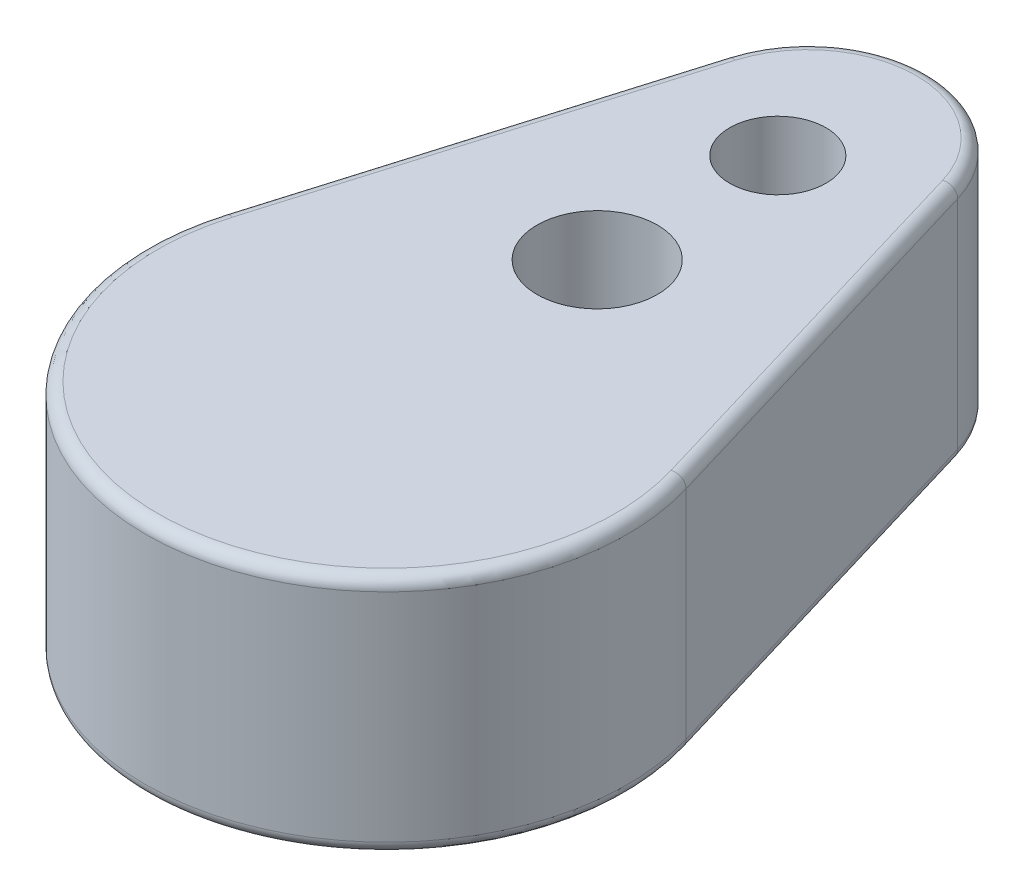
ISO-10303-21;
HEADER;
FILE_DESCRIPTION(('STEP AP214'),'2;1');
FILE_NAME('part.step','',(''),(''),'','','');
FILE_SCHEMA(('AUTOMOTIVE_DESIGN { 1 0 10303 214 1 1 1 1 }'));
ENDSEC;
DATA;
#1=APPLICATION_CONTEXT('core data for automotive mechanical design processes');
#2=APPLICATION_PROTOCOL_DEFINITION('international standard','automotive_design',2000,#1);
#3=PRODUCT_CONTEXT('',#1,'mechanical');
#4=PRODUCT('Part','Part','',(#3));
#5=PRODUCT_RELATED_PRODUCT_CATEGORY('part','',(#4));
#6=PRODUCT_DEFINITION_FORMATION('','',#4);
#7=PRODUCT_DEFINITION_CONTEXT('part definition',#1,'design');
#8=PRODUCT_DEFINITION('design','',#6,#7);
#9=PRODUCT_DEFINITION_SHAPE('','',#8);
#10=(LENGTH_UNIT() NAMED_UNIT(*) SI_UNIT(.MILLI.,.METRE.));
#11=(NAMED_UNIT(*) PLANE_ANGLE_UNIT() SI_UNIT($,.RADIAN.));
#12=(NAMED_UNIT(*) SI_UNIT($,.STERADIAN.) SOLID_ANGLE_UNIT());
#13=UNCERTAINTY_MEASURE_WITH_UNIT(LENGTH_MEASURE(1.E-05),#10,'distance_accuracy_value','');
#14=(GEOMETRIC_REPRESENTATION_CONTEXT(3) GLOBAL_UNCERTAINTY_ASSIGNED_CONTEXT((#13)) GLOBAL_UNIT_ASSIGNED_CONTEXT((#10,
#11,#12)) REPRESENTATION_CONTEXT('',''));
#15=CARTESIAN_POINT('',(0.,0.,0.));
#16=DIRECTION('',(0.,0.,1.));
#17=DIRECTION('',(1.,0.,0.));
#18=AXIS2_PLACEMENT_3D('',#15,#16,#17);
#19=CARTESIAN_POINT('',(0.,20.,17.5));
#20=DIRECTION('',(0.,-1.,0.));
#21=DIRECTION('',(0.,0.,-1.));
#22=AXIS2_PLACEMENT_3D('',#19,#20,#21);
#23=CYLINDRICAL_SURFACE('',#22,20.);
#24=DIRECTION('',(0.,-1.,0.));
#25=VECTOR('',#24,1.);
#26=CARTESIAN_POINT('',(-19.1662969499982,20.,11.7857142857143));
#27=LINE('',#26,#25);
#28=CARTESIAN_POINT('',(-19.1662969499982,19.,11.7857142857143));
#29=VERTEX_POINT('',#28);
#30=CARTESIAN_POINT('',(-19.1662969499982,1.,11.7857142857143));
#31=VERTEX_POINT('',#30);
#32=EDGE_CURVE('E111',#29,#31,#27,.T.);
#33=ORIENTED_EDGE('',*,*,#32,.T.);
#34=CARTESIAN_POINT('',(0.,1.,17.5));
#35=DIRECTION('',(0.,1.,0.));
#36=DIRECTION('',(0.,0.,1.));
#37=AXIS2_PLACEMENT_3D('',#34,#35,#36);
#38=CIRCLE('',#37,20.);
#39=CARTESIAN_POINT('',(19.1662969499982,1.,11.7857142857143));
#40=VERTEX_POINT('',#39);
#41=EDGE_CURVE('E220',#31,#40,#38,.T.);
#42=ORIENTED_EDGE('',*,*,#41,.T.);
#43=DIRECTION('',(0.,-1.,0.));
#44=VECTOR('',#43,1.);
#45=CARTESIAN_POINT('',(19.1662969499982,20.,11.7857142857143));
#46=LINE('',#45,#44);
#47=CARTESIAN_POINT('',(19.1662969499982,19.,11.7857142857143));
#48=VERTEX_POINT('',#47);
#49=EDGE_CURVE('E140',#48,#40,#46,.T.);
#50=ORIENTED_EDGE('',*,*,#49,.F.);
#51=CARTESIAN_POINT('',(0.,19.,17.5));
#52=DIRECTION('',(0.,1.,0.));
#53=DIRECTION('',(0.,0.,1.));
#54=AXIS2_PLACEMENT_3D('',#51,#52,#53);
#55=CIRCLE('',#54,20.);
#56=EDGE_CURVE('E217',#48,#29,#55,.F.);
#57=ORIENTED_EDGE('',*,*,#56,.T.);
#58=EDGE_LOOP('',(#33,#42,#50,#57));
#59=FACE_BOUND('',#58,.T.);
#60=ADVANCED_FACE('F39',(#59),#23,.T.);
#61=CARTESIAN_POINT('',(9.58314847499909,20.,-20.3571428571429));
#62=DIRECTION('',(-0.95831484749991,0.,0.285714285714286));
#63=DIRECTION('',(0.285714285714286,0.,0.95831484749991));
#64=AXIS2_PLACEMENT_3D('',#61,#62,#63);
#65=PLANE('',#64);
#66=ORIENTED_EDGE('',*,*,#49,.T.);
#67=DIRECTION('',(-0.285714285714286,0.,-0.95831484749991));
#68=VECTOR('',#67,1.);
#69=CARTESIAN_POINT('',(9.58314847499909,1.,-20.3571428571429));
#70=LINE('',#69,#68);
#71=CARTESIAN_POINT('',(9.5831484749991,1.,-20.3571428571429));
#72=VERTEX_POINT('',#71);
#73=EDGE_CURVE('E214',#40,#72,#70,.T.);
#74=ORIENTED_EDGE('',*,*,#73,.T.);
#75=DIRECTION('',(0.,-1.,0.));
#76=VECTOR('',#75,1.);
#77=CARTESIAN_POINT('',(9.5831484749991,20.,-20.3571428571429));
#78=LINE('',#77,#76);
#79=CARTESIAN_POINT('',(9.5831484749991,19.,-20.3571428571429));
#80=VERTEX_POINT('',#79);
#81=EDGE_CURVE('E130',#80,#72,#78,.T.);
#82=ORIENTED_EDGE('',*,*,#81,.F.);
#83=DIRECTION('',(-0.285714285714286,0.,-0.95831484749991));
#84=VECTOR('',#83,1.);
#85=CARTESIAN_POINT('',(19.1662969499982,19.,11.7857142857143));
#86=LINE('',#85,#84);
#87=EDGE_CURVE('E211',#80,#48,#86,.F.);
#88=ORIENTED_EDGE('',*,*,#87,.T.);
#89=EDGE_LOOP('',(#66,#74,#82,#88));
#90=FACE_BOUND('',#89,.T.);
#91=ADVANCED_FACE('F236',(#90),#65,.F.);
#92=CARTESIAN_POINT('',(0.,20.,-17.5));
#93=DIRECTION('',(0.,-1.,0.));
#94=DIRECTION('',(0.,0.,-1.));
#95=AXIS2_PLACEMENT_3D('',#92,#93,#94);
#96=CYLINDRICAL_SURFACE('',#95,10.);
#97=ORIENTED_EDGE('',*,*,#81,.T.);
#98=CARTESIAN_POINT('',(0.,1.,-17.5));
#99=DIRECTION('',(0.,1.,0.));
#100=DIRECTION('',(0.,0.,1.));
#101=AXIS2_PLACEMENT_3D('',#98,#99,#100);
#102=CIRCLE('',#101,10.);
#103=CARTESIAN_POINT('',(-9.5831484749991,1.,-20.3571428571429));
#104=VERTEX_POINT('',#103);
#105=EDGE_CURVE('E128',#72,#104,#102,.T.);
#106=ORIENTED_EDGE('',*,*,#105,.T.);
#107=DIRECTION('',(0.,-1.,0.));
#108=VECTOR('',#107,1.);
#109=CARTESIAN_POINT('',(-9.5831484749991,20.,-20.3571428571429));
#110=LINE('',#109,#108);
#111=CARTESIAN_POINT('',(-9.5831484749991,19.,-20.3571428571429));
#112=VERTEX_POINT('',#111);
#113=EDGE_CURVE('E109',#112,#104,#110,.T.);
#114=ORIENTED_EDGE('',*,*,#113,.F.);
#115=CARTESIAN_POINT('',(0.,19.,-17.5));
#116=DIRECTION('',(0.,1.,0.));
#117=DIRECTION('',(0.,0.,1.));
#118=AXIS2_PLACEMENT_3D('',#115,#116,#117);
#119=CIRCLE('',#118,10.);
#120=EDGE_CURVE('E125',#112,#80,#119,.F.);
#121=ORIENTED_EDGE('',*,*,#120,.T.);
#122=EDGE_LOOP('',(#97,#106,#114,#121));
#123=FACE_BOUND('',#122,.T.);
#124=ADVANCED_FACE('F124',(#123),#96,.T.);
#125=CARTESIAN_POINT('',(-9.5831484749991,20.,-20.3571428571429));
#126=DIRECTION('',(0.95831484749991,0.,0.285714285714286));
#127=DIRECTION('',(0.285714285714286,0.,-0.95831484749991));
#128=AXIS2_PLACEMENT_3D('',#125,#126,#127);
#129=PLANE('',#128);
#130=ORIENTED_EDGE('',*,*,#113,.T.);
#131=DIRECTION('',(-0.285714285714286,0.,0.95831484749991));
#132=VECTOR('',#131,1.);
#133=CARTESIAN_POINT('',(-9.5831484749991,1.,-20.3571428571429));
#134=LINE('',#133,#132);
#135=EDGE_CURVE('E11',#104,#31,#134,.T.);
#136=ORIENTED_EDGE('',*,*,#135,.T.);
#137=ORIENTED_EDGE('',*,*,#32,.F.);
#138=DIRECTION('',(-0.285714285714286,0.,0.95831484749991));
#139=VECTOR('',#138,1.);
#140=CARTESIAN_POINT('',(-9.5831484749991,19.,-20.3571428571429));
#141=LINE('',#140,#139);
#142=EDGE_CURVE('E49',#29,#112,#141,.F.);
#143=ORIENTED_EDGE('',*,*,#142,.T.);
#144=EDGE_LOOP('',(#130,#136,#137,#143));
#145=FACE_BOUND('',#144,.T.);
#146=ADVANCED_FACE('F108',(#145),#129,.F.);
#147=CARTESIAN_POINT('',(0.,20.,17.5));
#148=DIRECTION('',(0.,1.,0.));
#149=DIRECTION('',(0.,0.,1.));
#150=AXIS2_PLACEMENT_3D('',#147,#148,#149);
#151=PLANE('',#150);
#152=CARTESIAN_POINT('',(0.,20.,-15.));
#153=DIRECTION('',(0.,1.,0.));
#154=DIRECTION('',(0.,0.,1.));
#155=AXIS2_PLACEMENT_3D('',#152,#153,#154);
#156=CIRCLE('',#155,4.);
#157=CARTESIAN_POINT('',(0.,20.,-11.));
#158=VERTEX_POINT('',#157);
#159=EDGE_CURVE('E297',#158,#158,#156,.T.);
#160=ORIENTED_EDGE('',*,*,#159,.F.);
#161=EDGE_LOOP('',(#160));
#162=FACE_BOUND('',#161,.T.);
#163=CARTESIAN_POINT('',(0.,20.,0.));
#164=DIRECTION('',(0.,-1.,0.));
#165=DIRECTION('',(0.,0.,-1.));
#166=AXIS2_PLACEMENT_3D('',#163,#164,#165);
#167=CIRCLE('',#166,5.);
#168=CARTESIAN_POINT('',(0.,20.,-5.));
#169=VERTEX_POINT('',#168);
#170=EDGE_CURVE('E293',#169,#169,#167,.T.);
#171=ORIENTED_EDGE('',*,*,#170,.T.);
#172=EDGE_LOOP('',(#171));
#173=FACE_BOUND('',#172,.T.);
#174=DIRECTION('',(-0.285714285714286,0.,-0.95831484749991));
#175=VECTOR('',#174,1.);
#176=CARTESIAN_POINT('',(8.62483362749918,20.,-20.0714285714286));
#177=LINE('',#176,#175);
#178=CARTESIAN_POINT('',(18.2079821024983,20.,12.0714285714286));
#179=VERTEX_POINT('',#178);
#180=CARTESIAN_POINT('',(8.62483362749918,20.,-20.0714285714286));
#181=VERTEX_POINT('',#180);
#182=EDGE_CURVE('E57',#179,#181,#177,.T.);
#183=ORIENTED_EDGE('',*,*,#182,.T.);
#184=CARTESIAN_POINT('',(0.,20.,-17.5));
#185=DIRECTION('',(0.,1.,0.));
#186=DIRECTION('',(0.,0.,1.));
#187=AXIS2_PLACEMENT_3D('',#184,#185,#186);
#188=CIRCLE('',#187,9.);
#189=CARTESIAN_POINT('',(-8.62483362749919,20.,-20.0714285714286));
#190=VERTEX_POINT('',#189);
#191=EDGE_CURVE('E117',#181,#190,#188,.T.);
#192=ORIENTED_EDGE('',*,*,#191,.T.);
#193=DIRECTION('',(-0.285714285714286,0.,0.95831484749991));
#194=VECTOR('',#193,1.);
#195=CARTESIAN_POINT('',(-18.2079821024983,20.,12.0714285714286));
#196=LINE('',#195,#194);
#197=CARTESIAN_POINT('',(-18.2079821024983,20.,12.0714285714286));
#198=VERTEX_POINT('',#197);
#199=EDGE_CURVE('E143',#190,#198,#196,.T.);
#200=ORIENTED_EDGE('',*,*,#199,.T.);
#201=CARTESIAN_POINT('',(0.,20.,17.5));
#202=DIRECTION('',(0.,1.,0.));
#203=DIRECTION('',(0.,0.,1.));
#204=AXIS2_PLACEMENT_3D('',#201,#202,#203);
#205=CIRCLE('',#204,19.);
#206=EDGE_CURVE('E62',#198,#179,#205,.T.);
#207=ORIENTED_EDGE('',*,*,#206,.T.);
#208=EDGE_LOOP('',(#183,#192,#200,#207));
#209=FACE_BOUND('',#208,.T.);
#210=ADVANCED_FACE('F230',(#162,#173,#209),#151,.T.);
#211=CARTESIAN_POINT('',(0.,0.,17.5));
#212=DIRECTION('',(0.,1.,0.));
#213=DIRECTION('',(0.,0.,1.));
#214=AXIS2_PLACEMENT_3D('',#211,#212,#213);
#215=PLANE('',#214);
#216=CARTESIAN_POINT('',(0.,0.,0.));
#217=DIRECTION('',(0.,1.,0.));
#218=DIRECTION('',(0.,0.,1.));
#219=AXIS2_PLACEMENT_3D('',#216,#217,#218);
#220=CIRCLE('',#219,4.1);
#221=CARTESIAN_POINT('',(0.,0.,4.1));
#222=VERTEX_POINT('',#221);
#223=EDGE_CURVE('E289',#222,#222,#220,.T.);
#224=ORIENTED_EDGE('',*,*,#223,.T.);
#225=EDGE_LOOP('',(#224));
#226=FACE_BOUND('',#225,.T.);
#227=CARTESIAN_POINT('',(0.,0.,-15.));
#228=DIRECTION('',(0.,1.,0.));
#229=DIRECTION('',(0.,0.,1.));
#230=AXIS2_PLACEMENT_3D('',#227,#228,#229);
#231=CIRCLE('',#230,4.);
#232=CARTESIAN_POINT('',(0.,0.,-11.));
#233=VERTEX_POINT('',#232);
#234=EDGE_CURVE('E145',#233,#233,#231,.T.);
#235=ORIENTED_EDGE('',*,*,#234,.T.);
#236=EDGE_LOOP('',(#235));
#237=FACE_BOUND('',#236,.T.);
#238=DIRECTION('',(-0.285714285714286,0.,0.95831484749991));
#239=VECTOR('',#238,1.);
#240=CARTESIAN_POINT('',(-18.2079821024983,0.,12.0714285714286));
#241=LINE('',#240,#239);
#242=CARTESIAN_POINT('',(-18.2079821024983,0.,12.0714285714286));
#243=VERTEX_POINT('',#242);
#244=CARTESIAN_POINT('',(-8.62483362749919,0.,-20.0714285714286));
#245=VERTEX_POINT('',#244);
#246=EDGE_CURVE('E198',#243,#245,#241,.F.);
#247=ORIENTED_EDGE('',*,*,#246,.T.);
#248=CARTESIAN_POINT('',(0.,0.,-17.5));
#249=DIRECTION('',(0.,1.,0.));
#250=DIRECTION('',(0.,0.,1.));
#251=AXIS2_PLACEMENT_3D('',#248,#249,#250);
#252=CIRCLE('',#251,9.);
#253=CARTESIAN_POINT('',(8.62483362749918,0.,-20.0714285714286));
#254=VERTEX_POINT('',#253);
#255=EDGE_CURVE('E207',#245,#254,#252,.F.);
#256=ORIENTED_EDGE('',*,*,#255,.T.);
#257=DIRECTION('',(-0.285714285714286,0.,-0.95831484749991));
#258=VECTOR('',#257,1.);
#259=CARTESIAN_POINT('',(18.2079821024983,0.,12.0714285714286));
#260=LINE('',#259,#258);
#261=CARTESIAN_POINT('',(18.2079821024983,0.,12.0714285714286));
#262=VERTEX_POINT('',#261);
#263=EDGE_CURVE('E204',#254,#262,#260,.F.);
#264=ORIENTED_EDGE('',*,*,#263,.T.);
#265=CARTESIAN_POINT('',(0.,0.,17.5));
#266=DIRECTION('',(0.,1.,0.));
#267=DIRECTION('',(0.,0.,1.));
#268=AXIS2_PLACEMENT_3D('',#265,#266,#267);
#269=CIRCLE('',#268,19.);
#270=EDGE_CURVE('E201',#262,#243,#269,.F.);
#271=ORIENTED_EDGE('',*,*,#270,.T.);
#272=EDGE_LOOP('',(#247,#256,#264,#271));
#273=FACE_BOUND('',#272,.T.);
#274=ADVANCED_FACE('F262',(#226,#237,#273),#215,.F.);
#275=CARTESIAN_POINT('',(0.,1.,17.5));
#276=DIRECTION('',(0.,1.,0.));
#277=DIRECTION('',(0.,0.,1.));
#278=AXIS2_PLACEMENT_3D('',#275,#276,#277);
#279=TOROIDAL_SURFACE('',#278,19.,1.);
#280=CARTESIAN_POINT('',(-18.2079821024983,1.,12.0714285714286));
#281=DIRECTION('',(0.285714285714285,0.,-0.95831484749991));
#282=DIRECTION('',(-0.95831484749991,0.,-0.285714285714285));
#283=AXIS2_PLACEMENT_3D('',#280,#281,#282);
#284=CIRCLE('',#283,1.);
#285=EDGE_CURVE('E172',#243,#31,#284,.T.);
#286=ORIENTED_EDGE('',*,*,#285,.F.);
#287=ORIENTED_EDGE('',*,*,#270,.F.);
#288=CARTESIAN_POINT('',(18.2079821024983,1.,12.0714285714286));
#289=DIRECTION('',(-0.285714285714285,0.,-0.95831484749991));
#290=DIRECTION('',(-0.95831484749991,0.,0.285714285714285));
#291=AXIS2_PLACEMENT_3D('',#288,#289,#290);
#292=CIRCLE('',#291,1.);
#293=EDGE_CURVE('E155',#40,#262,#292,.T.);
#294=ORIENTED_EDGE('',*,*,#293,.F.);
#295=ORIENTED_EDGE('',*,*,#41,.F.);
#296=EDGE_LOOP('',(#286,#287,#294,#295));
#297=FACE_BOUND('',#296,.T.);
#298=ADVANCED_FACE('F238',(#297),#279,.T.);
#299=CARTESIAN_POINT('',(8.62483362749918,1.,-20.0714285714286));
#300=DIRECTION('',(-0.285714285714286,0.,-0.95831484749991));
#301=DIRECTION('',(-0.95831484749991,0.,0.285714285714286));
#302=AXIS2_PLACEMENT_3D('',#299,#300,#301);
#303=CYLINDRICAL_SURFACE('',#302,1.);
#304=ORIENTED_EDGE('',*,*,#293,.T.);
#305=ORIENTED_EDGE('',*,*,#263,.F.);
#306=CARTESIAN_POINT('',(8.62483362749918,1.,-20.0714285714286));
#307=DIRECTION('',(-0.285714285714285,0.,-0.95831484749991));
#308=DIRECTION('',(-0.95831484749991,0.,0.285714285714285));
#309=AXIS2_PLACEMENT_3D('',#306,#307,#308);
#310=CIRCLE('',#309,1.);
#311=EDGE_CURVE('E165',#72,#254,#310,.T.);
#312=ORIENTED_EDGE('',*,*,#311,.F.);
#313=ORIENTED_EDGE('',*,*,#73,.F.);
#314=EDGE_LOOP('',(#304,#305,#312,#313));
#315=FACE_BOUND('',#314,.T.);
#316=ADVANCED_FACE('F241',(#315),#303,.T.);
#317=CARTESIAN_POINT('',(-8.62483362749919,1.,-20.0714285714286));
#318=DIRECTION('',(-0.285714285714286,0.,0.95831484749991));
#319=DIRECTION('',(0.95831484749991,0.,0.285714285714286));
#320=AXIS2_PLACEMENT_3D('',#317,#318,#319);
#321=CYLINDRICAL_SURFACE('',#320,1.);
#322=ORIENTED_EDGE('',*,*,#285,.T.);
#323=ORIENTED_EDGE('',*,*,#135,.F.);
#324=CARTESIAN_POINT('',(-8.62483362749919,1.,-20.0714285714286));
#325=DIRECTION('',(0.285714285714285,0.,-0.95831484749991));
#326=DIRECTION('',(-0.95831484749991,0.,-0.285714285714285));
#327=AXIS2_PLACEMENT_3D('',#324,#325,#326);
#328=CIRCLE('',#327,1.);
#329=EDGE_CURVE('E162',#245,#104,#328,.T.);
#330=ORIENTED_EDGE('',*,*,#329,.F.);
#331=ORIENTED_EDGE('',*,*,#246,.F.);
#332=EDGE_LOOP('',(#322,#323,#330,#331));
#333=FACE_BOUND('',#332,.T.);
#334=ADVANCED_FACE('F244',(#333),#321,.T.);
#335=CARTESIAN_POINT('',(0.,1.,-17.5));
#336=DIRECTION('',(0.,1.,0.));
#337=DIRECTION('',(0.,0.,1.));
#338=AXIS2_PLACEMENT_3D('',#335,#336,#337);
#339=TOROIDAL_SURFACE('',#338,9.,1.);
#340=ORIENTED_EDGE('',*,*,#311,.T.);
#341=ORIENTED_EDGE('',*,*,#255,.F.);
#342=ORIENTED_EDGE('',*,*,#329,.T.);
#343=ORIENTED_EDGE('',*,*,#105,.F.);
#344=EDGE_LOOP('',(#340,#341,#342,#343));
#345=FACE_BOUND('',#344,.T.);
#346=ADVANCED_FACE('F242',(#345),#339,.T.);
#347=CARTESIAN_POINT('',(0.,19.,17.5));
#348=DIRECTION('',(0.,1.,0.));
#349=DIRECTION('',(0.,0.,1.));
#350=AXIS2_PLACEMENT_3D('',#347,#348,#349);
#351=TOROIDAL_SURFACE('',#350,19.,1.);
#352=CARTESIAN_POINT('',(-18.2079821024983,19.,12.0714285714286));
#353=DIRECTION('',(0.285714285714285,0.,-0.95831484749991));
#354=DIRECTION('',(-0.95831484749991,0.,-0.285714285714285));
#355=AXIS2_PLACEMENT_3D('',#352,#353,#354);
#356=CIRCLE('',#355,1.);
#357=EDGE_CURVE('E149',#29,#198,#356,.T.);
#358=ORIENTED_EDGE('',*,*,#357,.F.);
#359=ORIENTED_EDGE('',*,*,#56,.F.);
#360=CARTESIAN_POINT('',(18.2079821024983,19.,12.0714285714286));
#361=DIRECTION('',(-0.285714285714287,0.,-0.95831484749991));
#362=DIRECTION('',(-0.95831484749991,0.,0.285714285714287));
#363=AXIS2_PLACEMENT_3D('',#360,#361,#362);
#364=CIRCLE('',#363,1.);
#365=EDGE_CURVE('E159',#179,#48,#364,.T.);
#366=ORIENTED_EDGE('',*,*,#365,.F.);
#367=ORIENTED_EDGE('',*,*,#206,.F.);
#368=EDGE_LOOP('',(#358,#359,#366,#367));
#369=FACE_BOUND('',#368,.T.);
#370=ADVANCED_FACE('F41',(#369),#351,.T.);
#371=CARTESIAN_POINT('',(18.2079821024983,19.,12.0714285714286));
#372=DIRECTION('',(0.285714285714286,0.,0.95831484749991));
#373=DIRECTION('',(0.95831484749991,0.,-0.285714285714286));
#374=AXIS2_PLACEMENT_3D('',#371,#372,#373);
#375=CYLINDRICAL_SURFACE('',#374,1.);
#376=ORIENTED_EDGE('',*,*,#365,.T.);
#377=ORIENTED_EDGE('',*,*,#87,.F.);
#378=CARTESIAN_POINT('',(8.62483362749918,19.,-20.0714285714286));
#379=DIRECTION('',(-0.285714285714284,0.,-0.95831484749991));
#380=DIRECTION('',(-0.95831484749991,0.,0.285714285714284));
#381=AXIS2_PLACEMENT_3D('',#378,#379,#380);
#382=CIRCLE('',#381,1.);
#383=EDGE_CURVE('E137',#181,#80,#382,.T.);
#384=ORIENTED_EDGE('',*,*,#383,.F.);
#385=ORIENTED_EDGE('',*,*,#182,.F.);
#386=EDGE_LOOP('',(#376,#377,#384,#385));
#387=FACE_BOUND('',#386,.T.);
#388=ADVANCED_FACE('F233',(#387),#375,.T.);
#389=CARTESIAN_POINT('',(-18.2079821024983,19.,12.0714285714286));
#390=DIRECTION('',(0.285714285714286,0.,-0.95831484749991));
#391=DIRECTION('',(-0.95831484749991,0.,-0.285714285714286));
#392=AXIS2_PLACEMENT_3D('',#389,#390,#391);
#393=CYLINDRICAL_SURFACE('',#392,1.);
#394=ORIENTED_EDGE('',*,*,#357,.T.);
#395=ORIENTED_EDGE('',*,*,#199,.F.);
#396=CARTESIAN_POINT('',(-8.62483362749919,19.,-20.0714285714286));
#397=DIRECTION('',(0.285714285714285,0.,-0.95831484749991));
#398=DIRECTION('',(-0.95831484749991,0.,-0.285714285714285));
#399=AXIS2_PLACEMENT_3D('',#396,#397,#398);
#400=CIRCLE('',#399,1.);
#401=EDGE_CURVE('E135',#112,#190,#400,.T.);
#402=ORIENTED_EDGE('',*,*,#401,.F.);
#403=ORIENTED_EDGE('',*,*,#142,.F.);
#404=EDGE_LOOP('',(#394,#395,#402,#403));
#405=FACE_BOUND('',#404,.T.);
#406=ADVANCED_FACE('F142',(#405),#393,.T.);
#407=CARTESIAN_POINT('',(0.,19.,-17.5));
#408=DIRECTION('',(0.,1.,0.));
#409=DIRECTION('',(0.,0.,1.));
#410=AXIS2_PLACEMENT_3D('',#407,#408,#409);
#411=TOROIDAL_SURFACE('',#410,9.,1.);
#412=ORIENTED_EDGE('',*,*,#383,.T.);
#413=ORIENTED_EDGE('',*,*,#120,.F.);
#414=ORIENTED_EDGE('',*,*,#401,.T.);
#415=ORIENTED_EDGE('',*,*,#191,.F.);
#416=EDGE_LOOP('',(#412,#413,#414,#415));
#417=FACE_BOUND('',#416,.T.);
#418=ADVANCED_FACE('F133',(#417),#411,.T.);
#419=CARTESIAN_POINT('',(0.,15.,-15.));
#420=DIRECTION('',(0.,-1.,0.));
#421=DIRECTION('',(0.,0.,-1.));
#422=AXIS2_PLACEMENT_3D('',#419,#420,#421);
#423=CYLINDRICAL_SURFACE('',#422,4.);
#424=ORIENTED_EDGE('',*,*,#234,.F.);
#425=EDGE_LOOP('',(#424));
#426=FACE_BOUND('',#425,.T.);
#427=ORIENTED_EDGE('',*,*,#159,.T.);
#428=EDGE_LOOP('',(#427));
#429=FACE_BOUND('',#428,.T.);
#430=ADVANCED_FACE('F269',(#426,#429),#423,.F.);
#431=CARTESIAN_POINT('',(0.,5.,0.));
#432=DIRECTION('',(0.,1.,0.));
#433=DIRECTION('',(0.,0.,1.));
#434=AXIS2_PLACEMENT_3D('',#431,#432,#433);
#435=CYLINDRICAL_SURFACE('',#434,5.);
#436=CARTESIAN_POINT('',(0.,5.,0.));
#437=DIRECTION('',(0.,-1.,0.));
#438=DIRECTION('',(0.,0.,-1.));
#439=AXIS2_PLACEMENT_3D('',#436,#437,#438);
#440=CIRCLE('',#439,5.);
#441=CARTESIAN_POINT('',(0.,5.,-5.));
#442=VERTEX_POINT('',#441);
#443=EDGE_CURVE('E152',#442,#442,#440,.T.);
#444=ORIENTED_EDGE('',*,*,#443,.T.);
#445=EDGE_LOOP('',(#444));
#446=FACE_BOUND('',#445,.T.);
#447=ORIENTED_EDGE('',*,*,#170,.F.);
#448=EDGE_LOOP('',(#447));
#449=FACE_BOUND('',#448,.T.);
#450=ADVANCED_FACE('F272',(#446,#449),#435,.F.);
#451=CARTESIAN_POINT('',(0.,5.,0.));
#452=DIRECTION('',(0.,-1.,0.));
#453=DIRECTION('',(0.,0.,-1.));
#454=AXIS2_PLACEMENT_3D('',#451,#452,#453);
#455=PLANE('',#454);
#456=CARTESIAN_POINT('',(0.,5.,0.));
#457=DIRECTION('',(0.,-1.,0.));
#458=DIRECTION('',(0.,0.,-1.));
#459=AXIS2_PLACEMENT_3D('',#456,#457,#458);
#460=CIRCLE('',#459,4.1);
#461=CARTESIAN_POINT('',(0.,5.,-4.1));
#462=VERTEX_POINT('',#461);
#463=EDGE_CURVE('E43',#462,#462,#460,.T.);
#464=ORIENTED_EDGE('',*,*,#463,.T.);
#465=EDGE_LOOP('',(#464));
#466=FACE_BOUND('',#465,.T.);
#467=ORIENTED_EDGE('',*,*,#443,.F.);
#468=EDGE_LOOP('',(#467));
#469=FACE_BOUND('',#468,.T.);
#470=ADVANCED_FACE('F276',(#466,#469),#455,.F.);
#471=CARTESIAN_POINT('',(0.,0.,0.));
#472=DIRECTION('',(0.,1.,0.));
#473=DIRECTION('',(0.,0.,1.));
#474=AXIS2_PLACEMENT_3D('',#471,#472,#473);
#475=CYLINDRICAL_SURFACE('',#474,4.1);
#476=ORIENTED_EDGE('',*,*,#223,.F.);
#477=EDGE_LOOP('',(#476));
#478=FACE_BOUND('',#477,.T.);
#479=ORIENTED_EDGE('',*,*,#463,.F.);
#480=EDGE_LOOP('',(#479));
#481=FACE_BOUND('',#480,.T.);
#482=ADVANCED_FACE('F280',(#478,#481),#475,.F.);
#483=CLOSED_SHELL('',(#60,#91,#124,#146,#210,#274,#298,#316,#334,#346,#370,#388,#406,#418,#430,
#450,#470,#482));
#484=MANIFOLD_SOLID_BREP('B2',#483);
#485=ADVANCED_BREP_SHAPE_REPRESENTATION('',(#18,#484),#14);
#486=SHAPE_DEFINITION_REPRESENTATION(#9,#485);
ENDSEC;
END-ISO-10303-21;
